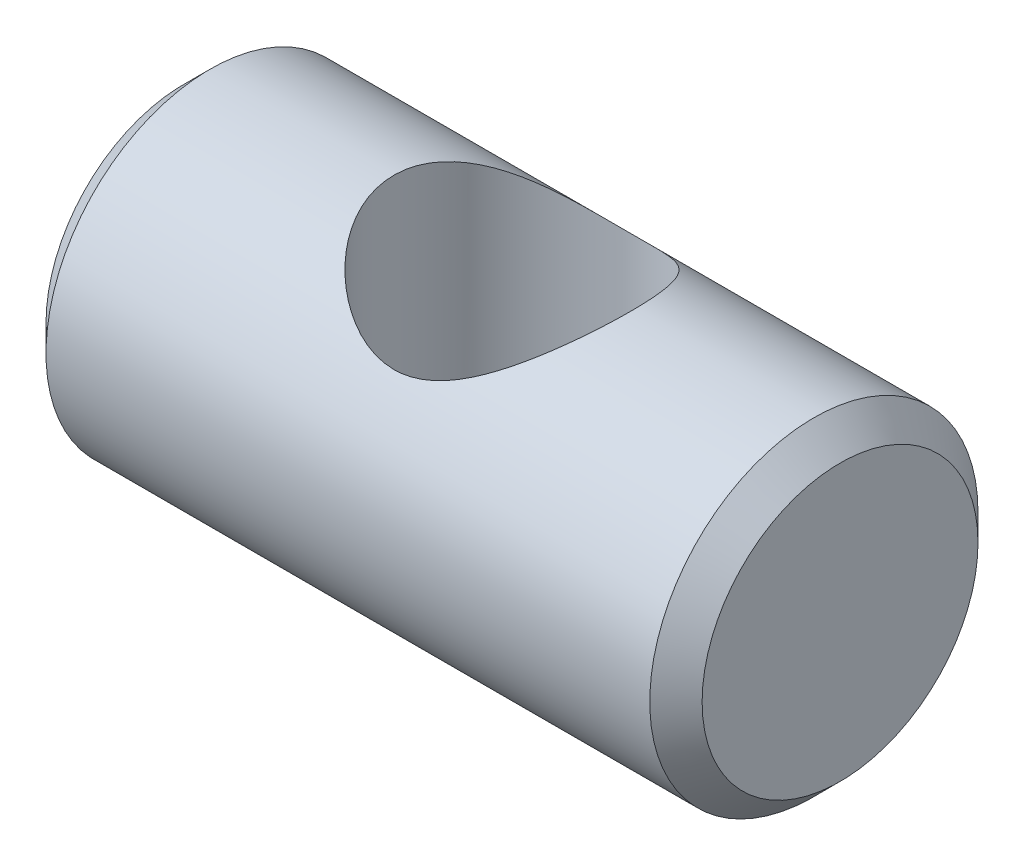
ISO-10303-21;
HEADER;
FILE_DESCRIPTION(('STEP AP214'),'2;1');
FILE_NAME('part.step','',(''),(''),'','','');
FILE_SCHEMA(('AUTOMOTIVE_DESIGN { 1 0 10303 214 1 1 1 1 }'));
ENDSEC;
DATA;
#1=APPLICATION_CONTEXT('core data for automotive mechanical design processes');
#2=APPLICATION_PROTOCOL_DEFINITION('international standard','automotive_design',2000,#1);
#3=PRODUCT_CONTEXT('',#1,'mechanical');
#4=PRODUCT('Part','Part','',(#3));
#5=PRODUCT_RELATED_PRODUCT_CATEGORY('part','',(#4));
#6=PRODUCT_DEFINITION_FORMATION('','',#4);
#7=PRODUCT_DEFINITION_CONTEXT('part definition',#1,'design');
#8=PRODUCT_DEFINITION('design','',#6,#7);
#9=PRODUCT_DEFINITION_SHAPE('','',#8);
#10=(LENGTH_UNIT() NAMED_UNIT(*) SI_UNIT(.MILLI.,.METRE.));
#11=(NAMED_UNIT(*) PLANE_ANGLE_UNIT() SI_UNIT($,.RADIAN.));
#12=(NAMED_UNIT(*) SI_UNIT($,.STERADIAN.) SOLID_ANGLE_UNIT());
#13=UNCERTAINTY_MEASURE_WITH_UNIT(LENGTH_MEASURE(1.E-05),#10,'distance_accuracy_value','');
#14=(GEOMETRIC_REPRESENTATION_CONTEXT(3) GLOBAL_UNCERTAINTY_ASSIGNED_CONTEXT((#13)) GLOBAL_UNIT_ASSIGNED_CONTEXT((#10,
#11,#12)) REPRESENTATION_CONTEXT('',''));
#15=CARTESIAN_POINT('',(0.,0.,0.));
#16=DIRECTION('',(0.,0.,1.));
#17=DIRECTION('',(1.,0.,0.));
#18=AXIS2_PLACEMENT_3D('',#15,#16,#17);
#19=CARTESIAN_POINT('',(19.05,0.,0.));
#20=DIRECTION('',(-1.,0.,0.));
#21=DIRECTION('',(0.,0.,1.));
#22=AXIS2_PLACEMENT_3D('',#19,#20,#21);
#23=CYLINDRICAL_SURFACE('',#22,4.765);
#24=CARTESIAN_POINT('',(6.09500000000002,-4.765,0.));
#25=CARTESIAN_POINT('',(6.09499959610919,-4.76500038568877,0.0847177312181432));
#26=CARTESIAN_POINT('',(6.09814294989109,-4.76273611404079,0.169430320303636));
#27=CARTESIAN_POINT('',(6.11066358139783,-4.75373529485614,0.33818363213569));
#28=CARTESIAN_POINT('',(6.12004307209303,-4.74699715971481,0.422224105655794));
#29=CARTESIAN_POINT('',(6.14488668170268,-4.72920873970222,0.588924625799263));
#30=CARTESIAN_POINT('',(6.16034991528612,-4.71815908226315,0.67158487145527));
#31=CARTESIAN_POINT('',(6.19712124740497,-4.69200787910789,0.834953469422152));
#32=CARTESIAN_POINT('',(6.21843186327193,-4.67690458834067,0.915660964741688));
#33=CARTESIAN_POINT('',(6.29045031365259,-4.62617094260924,1.15316852650018));
#34=CARTESIAN_POINT('',(6.34940304855711,-4.58500087201718,1.30638348551208));
#35=CARTESIAN_POINT('',(6.48662140964981,-4.49105510154723,1.59983536201371));
#36=CARTESIAN_POINT('',(6.56488973292429,-4.43827778103067,1.74007046332845));
#37=CARTESIAN_POINT('',(6.7460643265636,-4.31945657534803,2.01800830989138));
#38=CARTESIAN_POINT('',(6.85055522655824,-4.25264577187922,2.15434410715857));
#39=CARTESIAN_POINT('',(7.07720249701712,-4.11387476134022,2.40879453024458));
#40=CARTESIAN_POINT('',(7.19938539007363,-4.04190690648764,2.52688123888939));
#41=CARTESIAN_POINT('',(7.40679935127932,-3.92720984424589,2.69967192688624));
#42=CARTESIAN_POINT('',(7.48688627416953,-3.88447566291621,2.76064098743456));
#43=CARTESIAN_POINT('',(7.65252198947693,-3.80018618586981,2.87556982119529));
#44=CARTESIAN_POINT('',(7.73807228820807,-3.75863121987704,2.92952764877966));
#45=CARTESIAN_POINT('',(8.00254996269114,-3.6377926860457,3.08028310521369));
#46=CARTESIAN_POINT('',(8.18969989876755,-3.56210417233018,3.16629454903273));
#47=CARTESIAN_POINT('',(8.51939485136452,-3.45483234736675,3.28229960783894));
#48=CARTESIAN_POINT('',(8.65669069310712,-3.4169079996449,3.32141402000292));
#49=CARTESIAN_POINT('',(8.93822532565401,-3.35646405161201,3.38249013814496));
#50=CARTESIAN_POINT('',(9.08244840668605,-3.33391120752371,3.40448887468735));
#51=CARTESIAN_POINT('',(9.37532101808956,-3.30777812718485,3.42989942477073));
#52=CARTESIAN_POINT('',(9.52399395961725,-3.30432779253818,3.43318398182583));
#53=CARTESIAN_POINT('',(9.81967723971873,-3.31741991298231,3.42052722324128));
#54=CARTESIAN_POINT('',(9.96668617107891,-3.33397817475834,3.40457070727668));
#55=CARTESIAN_POINT('',(10.2721444513951,-3.38720452815873,3.35165699745504));
#56=CARTESIAN_POINT('',(10.4297818990276,-3.42609235464718,3.31236160200858));
#57=CARTESIAN_POINT('',(10.7342016018763,-3.51870609796138,3.21379149174679));
#58=CARTESIAN_POINT('',(10.8809584419369,-3.5724654481807,3.15447169211428));
#59=CARTESIAN_POINT('',(11.1144910062973,-3.66874066104023,3.04123108769056));
#60=CARTESIAN_POINT('',(11.2047445197354,-3.70889613431009,2.99228862221962));
#61=CARTESIAN_POINT('',(11.3798000082336,-3.79139086166971,2.8870476482067));
#62=CARTESIAN_POINT('',(11.4646024512642,-3.83372992773559,2.83074977238328));
#63=CARTESIAN_POINT('',(11.6286819133287,-3.91929841302884,2.71104159493219));
#64=CARTESIAN_POINT('',(11.7079534823531,-3.96252865756137,2.64762443422857));
#65=CARTESIAN_POINT('',(11.8606767388077,-4.04867094531033,2.51392387266249));
#66=CARTESIAN_POINT('',(11.9341281711495,-4.09158297450521,2.44364017115065));
#67=CARTESIAN_POINT('',(12.0756650372272,-4.17647896934048,2.29556362017696));
#68=CARTESIAN_POINT('',(12.143681799347,-4.21844733040164,2.21769602860418));
#69=CARTESIAN_POINT('',(12.272955350599,-4.29989137491217,2.05533634915456));
#70=CARTESIAN_POINT('',(12.3342132241495,-4.33936745779475,1.97084532769427));
#71=CARTESIAN_POINT('',(12.4492886648785,-4.41473694574765,1.79565917341629));
#72=CARTESIAN_POINT('',(12.5031195069431,-4.450636710244,1.70497555461375));
#73=CARTESIAN_POINT('',(12.6027495296725,-4.51791109785315,1.51776399509765));
#74=CARTESIAN_POINT('',(12.6485517365294,-4.54928742516665,1.42123827495272));
#75=CARTESIAN_POINT('',(12.7515745829349,-4.62050977119313,1.17456544061184));
#76=CARTESIAN_POINT('',(12.8035135239563,-4.65705260614719,1.02117281951566));
#77=CARTESIAN_POINT('',(12.8855010346838,-4.71513040060247,0.705988354234497));
#78=CARTESIAN_POINT('',(12.9155656190444,-4.73667633912987,0.544202747877958));
#79=CARTESIAN_POINT('',(12.9521791839077,-4.76295229392978,0.216031392103874));
#80=CARTESIAN_POINT('',(12.9586488497531,-4.76762559205244,0.0496320182090406));
#81=CARTESIAN_POINT('',(12.9474171737367,-4.75954299671493,-0.281922100999027));
#82=CARTESIAN_POINT('',(12.9297138780254,-4.7467856943759,-0.447076744618354));
#83=CARTESIAN_POINT('',(12.8727712937309,-4.70611618732336,-0.762721414921801));
#84=CARTESIAN_POINT('',(12.8346822723299,-4.67901421356729,-0.913529209504882));
#85=CARTESIAN_POINT('',(12.7396420868632,-4.61227785723414,-1.20609143238786));
#86=CARTESIAN_POINT('',(12.6826870564159,-4.57264090582636,-1.34784399780876));
#87=CARTESIAN_POINT('',(12.5463466735088,-4.47952673140869,-1.63197484348943));
#88=CARTESIAN_POINT('',(12.4654302950781,-4.42513949950625,-1.77331394441545));
#89=CARTESIAN_POINT('',(12.2864111819194,-4.30826168389104,-2.04094926429533));
#90=CARTESIAN_POINT('',(12.1882959109976,-4.24576519807202,-2.16723439689698));
#91=CARTESIAN_POINT('',(11.9576271688715,-4.10465299201109,-2.42536936475177));
#92=CARTESIAN_POINT('',(11.8220558438335,-4.02517333112418,-2.55405118470738));
#93=CARTESIAN_POINT('',(11.5315920206205,-3.866764636456,-2.78806591398091));
#94=CARTESIAN_POINT('',(11.3766870366769,-3.78783599362576,-2.89338361144201));
#95=CARTESIAN_POINT('',(11.0717646403691,-3.6492564097843,-3.06571333919893));
#96=CARTESIAN_POINT('',(10.924148945703,-3.58845735903786,-3.1360351201623));
#97=CARTESIAN_POINT('',(10.6162506817858,-3.48002124223204,-3.25595284611108));
#98=CARTESIAN_POINT('',(10.4559956729631,-3.43235650407537,-3.30559248021485));
#99=CARTESIAN_POINT('',(10.158089931823,-3.36518869683095,-3.37380690797711));
#100=CARTESIAN_POINT('',(10.0222632529116,-3.34197440203271,-3.39659121549822));
#101=CARTESIAN_POINT('',(9.74710649968959,-3.31225678048614,-3.42558639072587));
#102=CARTESIAN_POINT('',(9.6077810239035,-3.30573257074766,-3.43181796993377));
#103=CARTESIAN_POINT('',(9.32963848724307,-3.31045774857882,-3.42725818139827));
#104=CARTESIAN_POINT('',(9.19082181868192,-3.32171876848702,-3.41645567260397));
#105=CARTESIAN_POINT('',(8.91761315614652,-3.36018548165847,-3.37862015400287));
#106=CARTESIAN_POINT('',(8.78322844018555,-3.38741614463826,-3.35156172524388));
#107=CARTESIAN_POINT('',(8.47901089021318,-3.46500445620298,-3.27153835075048));
#108=CARTESIAN_POINT('',(8.31185103658576,-3.52000205613634,-3.21301195645724));
#109=CARTESIAN_POINT('',(7.99221338480471,-3.6425018189336,-3.07343681610102));
#110=CARTESIAN_POINT('',(7.83976074812907,-3.71002485349893,-2.99235036276751));
#111=CARTESIAN_POINT('',(7.54624351433185,-3.85212789013876,-2.80719769512117));
#112=CARTESIAN_POINT('',(7.40561832733594,-3.92685271703972,-2.7025506739677));
#113=CARTESIAN_POINT('',(7.14152022812123,-4.07546327279583,-2.47275982811188));
#114=CARTESIAN_POINT('',(7.01805331588238,-4.14934869987431,-2.34760886666907));
#115=CARTESIAN_POINT('',(6.83635821689446,-4.26219687307588,-2.13240779190859));
#116=CARTESIAN_POINT('',(6.77192267768827,-4.30321102404401,-2.04859844379145));
#117=CARTESIAN_POINT('',(6.6504516655069,-4.38191825181171,-1.87433788931678));
#118=CARTESIAN_POINT('',(6.59341288108394,-4.41961281231398,-1.78388968370403));
#119=CARTESIAN_POINT('',(6.48745606054911,-4.49059625248441,-1.59680172900397));
#120=CARTESIAN_POINT('',(6.43853230591874,-4.52388823119142,-1.5001664069973));
#121=CARTESIAN_POINT('',(6.34955220596911,-4.5850571293326,-1.301264375057));
#122=CARTESIAN_POINT('',(6.30949296081786,-4.61293581924006,-1.19899952041401));
#123=CARTESIAN_POINT('',(6.2450964516419,-4.65807487009905,-1.00771753586218));
#124=CARTESIAN_POINT('',(6.21924023703891,-4.67633675824679,-0.919445875934476));
#125=CARTESIAN_POINT('',(6.17457046904347,-4.70802022116129,-0.740296298593746));
#126=CARTESIAN_POINT('',(6.15575528330252,-4.72144291778977,-0.649418990524394));
#127=CARTESIAN_POINT('',(6.12552125844282,-4.74306537715817,-0.465920761812788));
#128=CARTESIAN_POINT('',(6.11409499638959,-4.75127038146896,-0.373301687543516));
#129=CARTESIAN_POINT('',(6.09883487265058,-4.76223727742007,-0.187119604642967));
#130=CARTESIAN_POINT('',(6.09500044603037,-4.76499957407079,-0.093556666768616));
#131=CARTESIAN_POINT('',(6.09500000000002,-4.765,0.));
#132=B_SPLINE_CURVE_WITH_KNOTS('',3,(#24,#25,#26,#27,#28,#29,#30,#31,#32,#33,#34,#35,#36,#37,
#38,#39,#40,#41,#42,#43,#44,#45,#46,#47,#48,#49,#50,#51,#52,#53,#54,#55,#56,#57,#58,#59,#60,#61,
#62,#63,#64,#65,#66,#67,#68,#69,#70,#71,#72,#73,#74,#75,#76,#77,#78,#79,#80,#81,#82,#83,#84,#85,
#86,#87,#88,#89,#90,#91,#92,#93,#94,#95,#96,#97,#98,#99,#100,#101,#102,#103,#104,#105,#106,#107,
#108,#109,#110,#111,#112,#113,#114,#115,#116,#117,#118,#119,#120,#121,#122,#123,#124,#125,#126,
#127,#128,#129,#130,#131),.UNSPECIFIED.,.T.,.F.,(4,2,2,2,2,2,2,2,2,2,2,2,2,2,2,2,2,2,2,2,2,2,2,
2,2,2,2,2,2,2,2,2,2,2,2,2,2,2,2,2,2,2,2,2,2,2,2,2,2,2,2,2,2,4),(0.,0.254056144534474,
0.508202492188904,0.762311869105355,1.01653081366771,1.52186449966476,2.0272687866938,
2.57821641184627,3.12999869834548,3.45770025357787,3.7854925531708,4.43939851343425,
4.88097136957113,5.32158618479439,5.76519363893576,6.20915176984628,6.70762640117556,
7.20723091465315,7.53759139604015,7.86792347822831,8.1985765954357,8.52924419668192,
8.86358500026263,9.19787208286409,9.53155370673103,9.86510928598013,10.360901375871,
10.856330120196,11.3534227282806,11.8505555176942,12.3222092140893,12.7939596306007,
13.3071563441909,13.8207286918533,14.4277422512297,15.0351498711535,15.5567378752995,
16.0772184174324,16.4944268013625,16.9111129093764,17.3280716616901,17.7456841045647,
18.2990144207386,18.853275196935,19.4230836966979,19.9930909508798,20.332859584608,
20.6724755785373,21.011851224868,21.3511156871554,21.6320471618883,21.9129134668015,
22.1934971724466,22.4740599981145),.UNSPECIFIED.);
#133=CARTESIAN_POINT('',(6.09500000000002,-4.765,0.));
#134=VERTEX_POINT('',#133);
#135=EDGE_CURVE('E10',#134,#134,#132,.T.);
#136=ORIENTED_EDGE('',*,*,#135,.T.);
#137=EDGE_LOOP('',(#136));
#138=FACE_BOUND('',#137,.T.);
#139=CARTESIAN_POINT('',(9.52500000000002,3.30761621111035,3.43));
#140=CARTESIAN_POINT('',(9.44359796146425,3.30761776842519,3.42999918864106));
#141=CARTESIAN_POINT('',(9.36218407056381,3.31063705514595,3.42709478577341));
#142=CARTESIAN_POINT('',(9.20016144139,3.32254520620497,3.41555039780778));
#143=CARTESIAN_POINT('',(9.11955323769195,3.33143773495609,3.40690683193314));
#144=CARTESIAN_POINT('',(8.95972677630651,3.35463714094608,3.38406531826882));
#145=CARTESIAN_POINT('',(8.88051232495892,3.36895698003822,3.36985407062161));
#146=CARTESIAN_POINT('',(8.72420699342421,3.40231588725374,3.33617036729262));
#147=CARTESIAN_POINT('',(8.64711738884878,3.42135772440774,3.31669482396565));
#148=CARTESIAN_POINT('',(8.42165336111231,3.48382518219671,3.25142621581383));
#149=CARTESIAN_POINT('',(8.27688018213992,3.53295223931879,3.19846108859091));
#150=CARTESIAN_POINT('',(7.99877939151398,3.64048939042037,3.07550378113376));
#151=CARTESIAN_POINT('',(7.86545060597325,3.69889853055096,3.00551335006843));
#152=CARTESIAN_POINT('',(7.58648070444628,3.83150331223241,2.83523058687006));
#153=CARTESIAN_POINT('',(7.44323542715552,3.90660269980671,2.73171543067713));
#154=CARTESIAN_POINT('',(7.17392980917619,4.05652006047322,2.5037001159196));
#155=CARTESIAN_POINT('',(7.04789275646875,4.13133752154036,2.37917201984086));
#156=CARTESIAN_POINT('',(6.86277920323917,4.24556805593846,2.16529760967855));
#157=CARTESIAN_POINT('',(6.79739511320831,4.28694907374565,2.08238514374896));
#158=CARTESIAN_POINT('',(6.67394608793832,4.36653195988115,1.9098781253717));
#159=CARTESIAN_POINT('',(6.61587782675788,4.40473527016354,1.82028663905997));
#160=CARTESIAN_POINT('',(6.50780139229153,4.47685118668652,1.63490106114947));
#161=CARTESIAN_POINT('',(6.45778201110923,4.51076974494608,1.53911585951493));
#162=CARTESIAN_POINT('',(6.36650662275987,4.57332525741562,1.34187667409253));
#163=CARTESIAN_POINT('',(6.32524649238828,4.60196469580302,1.24042538601124));
#164=CARTESIAN_POINT('',(6.23637581543262,4.66411353106844,0.987312568578566));
#165=CARTESIAN_POINT('',(6.19380454317669,4.69432595851433,0.832999309907671));
#166=CARTESIAN_POINT('',(6.13051974711707,4.73944390060314,0.517884205864162));
#167=CARTESIAN_POINT('',(6.10978809483452,4.75436211028707,0.357087857239514));
#168=CARTESIAN_POINT('',(6.09131818644795,4.76764635210463,0.0331106632530537));
#169=CARTESIAN_POINT('',(6.09363034381811,4.76597609329068,-0.130074629940496));
#170=CARTESIAN_POINT('',(6.12123458778608,4.74614098997373,-0.453473660086339));
#171=CARTESIAN_POINT('',(6.14653275434741,4.72797178138148,-0.613686599388157));
#172=CARTESIAN_POINT('',(6.21764552540146,4.67742620490943,-0.922349059984801));
#173=CARTESIAN_POINT('',(6.26288265392544,4.64545020844664,-1.07100011329414));
#174=CARTESIAN_POINT('',(6.37162441351807,4.56974645623048,-1.35820766764044));
#175=CARTESIAN_POINT('',(6.43513269106296,4.52601635475872,-1.49676214672241));
#176=CARTESIAN_POINT('',(6.58618148777766,4.42419680091417,-1.77658934822833));
#177=CARTESIAN_POINT('',(6.67560842239394,4.36505164034656,-1.91645292811232));
#178=CARTESIAN_POINT('',(6.87175812429219,4.23961424044081,-2.1799632079838));
#179=CARTESIAN_POINT('',(6.97849823576941,4.17331485658966,-2.30359341841757));
#180=CARTESIAN_POINT('',(7.22875272169333,4.02505079077683,-2.55524493897775));
#181=CARTESIAN_POINT('',(7.37541263307137,3.9424711733114,-2.67978228741706));
#182=CARTESIAN_POINT('',(7.68878036903881,3.78073783732062,-2.90349117675101));
#183=CARTESIAN_POINT('',(7.85548885435193,3.70158423182039,-3.00266188132186));
#184=CARTESIAN_POINT('',(8.16882893018811,3.57266844152221,-3.15418366724013));
#185=CARTESIAN_POINT('',(8.31170273924315,3.52028223872797,-3.21204111340728));
#186=CARTESIAN_POINT('',(8.60787948423819,3.42953641535839,-3.3087656279113));
#187=CARTESIAN_POINT('',(8.76115832282199,3.39114561413462,-3.34767497692611));
#188=CARTESIAN_POINT('',(9.05124602577449,3.33881503385712,-3.39981036860877));
#189=CARTESIAN_POINT('',(9.18698300968215,3.32203140316326,-3.41605679352166));
#190=CARTESIAN_POINT('',(9.46043061576793,3.30543988741879,-3.43211991719663));
#191=CARTESIAN_POINT('',(9.59813974562484,3.30561978122036,-3.4319484440158));
#192=CARTESIAN_POINT('',(9.87118187803283,3.32288915506671,-3.41522391835476));
#193=CARTESIAN_POINT('',(10.0065185824781,3.33994935122144,-3.39869923535787));
#194=CARTESIAN_POINT('',(10.27186074815,3.38836511388486,-3.35042547694232));
#195=CARTESIAN_POINT('',(10.4018578883026,3.4197421339738,-3.31865355000988));
#196=CARTESIAN_POINT('',(10.7064553675357,3.50813233030795,-3.22549691393665));
#197=CARTESIAN_POINT('',(10.8774349580402,3.57038174524695,-3.15730866715353));
#198=CARTESIAN_POINT('',(11.20303526365,3.70595313818717,-2.9970272592147));
#199=CARTESIAN_POINT('',(11.357622746024,3.77929690501084,-2.90488679526846));
#200=CARTESIAN_POINT('',(11.6536763340265,3.93129198316696,-2.69580359039099));
#201=CARTESIAN_POINT('',(11.7946581424325,4.01003416415893,-2.5782425092746));
#202=CARTESIAN_POINT('',(12.0569445891547,4.16411342053437,-2.32116677073248));
#203=CARTESIAN_POINT('',(12.178267053333,4.23945353546831,-2.18167222994526));
#204=CARTESIAN_POINT('',(12.3916016940623,4.37624244780666,-1.89150742529311));
#205=CARTESIAN_POINT('',(12.4849983293556,4.43827339699239,-1.742135506112));
#206=CARTESIAN_POINT('',(12.6492032541642,4.54942980885924,-1.42679036463322));
#207=CARTESIAN_POINT('',(12.7200193923573,4.5985597547059,-1.26082293711808));
#208=CARTESIAN_POINT('',(12.806774492904,4.6593942518596,-1.00164613231786));
#209=CARTESIAN_POINT('',(12.8325205426448,4.67758234033205,-0.913120057388833));
#210=CARTESIAN_POINT('',(12.8769322872855,4.70908970031716,-0.73347886885611));
#211=CARTESIAN_POINT('',(12.8956016283031,4.72241147895955,-0.642365114580646));
#212=CARTESIAN_POINT('',(12.9255123075814,4.74380655916189,-0.458369221699818));
#213=CARTESIAN_POINT('',(12.9367575626452,4.75188262821961,-0.365488042208054));
#214=CARTESIAN_POINT('',(12.9516150584392,4.76256113402722,-0.178809575019191));
#215=CARTESIAN_POINT('',(12.9552283965806,4.76516435773006,-0.0850124209810961));
#216=CARTESIAN_POINT('',(12.9547818053649,4.76484297924135,0.0897828195454044));
#217=CARTESIAN_POINT('',(12.9516988117277,4.7626221588484,0.170786319987316));
#218=CARTESIAN_POINT('',(12.9398388522843,4.75409668800219,0.332167355747924));
#219=CARTESIAN_POINT('',(12.9310600364174,4.74779071064953,0.412544679090379));
#220=CARTESIAN_POINT('',(12.8963446664959,4.72292339365472,0.651781033805039));
#221=CARTESIAN_POINT('',(12.8620284020266,4.6984119598312,0.808913944039926));
#222=CARTESIAN_POINT('',(12.7734535548455,4.6359263768828,1.11229121692376));
#223=CARTESIAN_POINT('',(12.719441439392,4.59811881071508,1.25864437324627));
#224=CARTESIAN_POINT('',(12.5937026333034,4.51167117995918,1.54003858984487));
#225=CARTESIAN_POINT('',(12.521973031034,4.46302933503015,1.6750777859319));
#226=CARTESIAN_POINT('',(12.3521445234142,4.35068587431454,1.94979264340275));
#227=CARTESIAN_POINT('',(12.2517838026686,4.28583519897226,2.0875903592959));
#228=CARTESIAN_POINT('',(12.0334263188984,4.15032061508074,2.34548702714922));
#229=CARTESIAN_POINT('',(11.9154039042247,4.07964831952234,2.4655597231043));
#230=CARTESIAN_POINT('',(11.7148360489843,3.96634971162313,2.64185348081618));
#231=CARTESIAN_POINT('',(11.6374009641132,3.92401508470718,2.70417268912592));
#232=CARTESIAN_POINT('',(11.4771427149644,3.84012139816795,2.82204524756536));
#233=CARTESIAN_POINT('',(11.3943181471876,3.79856254422233,2.87759682440142));
#234=CARTESIAN_POINT('',(11.1380830175248,3.67690814111049,3.03361744392612));
#235=CARTESIAN_POINT('',(10.9566328866015,3.59966945231082,3.12369786533345));
#236=CARTESIAN_POINT('',(10.6313974249465,3.48551924779467,3.24982741718261));
#237=CARTESIAN_POINT('',(10.4925859499066,3.44345626817472,3.29397865224323));
#238=CARTESIAN_POINT('',(10.2785973115811,3.39167249586216,3.34699608430657));
#239=CARTESIAN_POINT('',(10.2063926297669,3.37630760622148,3.36245672146341));
#240=CARTESIAN_POINT('',(10.0603864100883,3.34989869642638,3.38876900247123));
#241=CARTESIAN_POINT('',(9.98658568874914,3.33885251955991,3.39962294708016));
#242=CARTESIAN_POINT('',(9.84825972326986,3.32276717723329,3.41534045687266));
#243=CARTESIAN_POINT('',(9.78387728785286,3.31710485104418,3.42082860533395));
#244=CARTESIAN_POINT('',(9.65466582300344,3.30952821170844,3.42815922145793));
#245=CARTESIAN_POINT('',(9.58983667113831,3.30761497071009,3.43000064624687));
#246=CARTESIAN_POINT('',(9.52500000000002,3.30761621111035,3.43));
#247=B_SPLINE_CURVE_WITH_KNOTS('',3,(#139,#140,#141,#142,#143,#144,#145,#146,#147,#148,#149,
#150,#151,#152,#153,#154,#155,#156,#157,#158,#159,#160,#161,#162,#163,#164,#165,#166,#167,#168,
#169,#170,#171,#172,#173,#174,#175,#176,#177,#178,#179,#180,#181,#182,#183,#184,#185,#186,#187,
#188,#189,#190,#191,#192,#193,#194,#195,#196,#197,#198,#199,#200,#201,#202,#203,#204,#205,#206,
#207,#208,#209,#210,#211,#212,#213,#214,#215,#216,#217,#218,#219,#220,#221,#222,#223,#224,#225,
#226,#227,#228,#229,#230,#231,#232,#233,#234,#235,#236,#237,#238,#239,#240,#241,#242,#243,#244,
#245,#246),.UNSPECIFIED.,.T.,.F.,(4,2,2,2,2,2,2,2,2,2,2,2,2,2,2,2,2,2,2,2,2,2,2,2,2,2,2,2,2,2,2,
2,2,2,2,2,2,2,2,2,2,2,2,2,2,2,2,2,2,2,2,2,2,4),(0.,0.244121231467741,0.488394918274502,
0.733255709481724,0.978260430666176,1.46158753667942,1.94486500693025,2.51897543457968,
3.09385526676081,3.43367812430526,3.77334592889189,4.11253658189007,4.45156721334802,
4.93801025474995,5.42404919398381,5.91115168482385,6.39838305526931,6.87234588132182,
7.34640336450454,7.87314437808767,8.40041637306114,9.02605952943899,9.65172331025712,
10.1385037543623,10.6241929647026,11.0355129972519,11.4465367019663,11.8568486121367,
12.267777399063,12.8475544509856,13.4284853093657,14.0255674248294,14.6221050769229,
15.1802237793126,15.7381482751203,16.0197030121132,16.3011124864339,16.5823733757045,
16.8635938190611,17.1065597222475,17.3496045827585,17.8351925843091,18.3149016758906,
18.7946896538131,19.3398903171276,19.8858906502389,20.2096761541077,20.5335463164645,
21.180081609351,21.6331768971706,21.8592026936634,22.085115471036,22.2795022924366,
22.4739446956891),.UNSPECIFIED.);
#248=CARTESIAN_POINT('',(9.52500000000002,3.30761621111035,3.43));
#249=VERTEX_POINT('',#248);
#250=EDGE_CURVE('E53',#249,#249,#247,.T.);
#251=ORIENTED_EDGE('',*,*,#250,.T.);
#252=EDGE_LOOP('',(#251));
#253=FACE_BOUND('',#252,.T.);
#254=CARTESIAN_POINT('',(0.760000000000007,0.,0.));
#255=DIRECTION('',(1.,0.,0.));
#256=DIRECTION('',(0.,0.,-1.));
#257=AXIS2_PLACEMENT_3D('',#254,#255,#256);
#258=CIRCLE('',#257,4.765);
#259=CARTESIAN_POINT('',(0.760000000000007,0.,-4.765));
#260=VERTEX_POINT('',#259);
#261=EDGE_CURVE('E96',#260,#260,#258,.T.);
#262=ORIENTED_EDGE('',*,*,#261,.T.);
#263=EDGE_LOOP('',(#262));
#264=FACE_BOUND('',#263,.T.);
#265=CARTESIAN_POINT('',(18.29,0.,0.));
#266=DIRECTION('',(1.,0.,0.));
#267=DIRECTION('',(0.,0.,-1.));
#268=AXIS2_PLACEMENT_3D('',#265,#266,#267);
#269=CIRCLE('',#268,4.765);
#270=CARTESIAN_POINT('',(18.29,0.,-4.765));
#271=VERTEX_POINT('',#270);
#272=EDGE_CURVE('E99',#271,#271,#269,.F.);
#273=ORIENTED_EDGE('',*,*,#272,.T.);
#274=EDGE_LOOP('',(#273));
#275=FACE_BOUND('',#274,.T.);
#276=ADVANCED_FACE('F39',(#138,#253,#264,#275),#23,.T.);
#277=CARTESIAN_POINT('',(19.05,0.,0.));
#278=DIRECTION('',(1.,0.,0.));
#279=DIRECTION('',(0.,0.,-1.));
#280=AXIS2_PLACEMENT_3D('',#277,#278,#279);
#281=PLANE('',#280);
#282=CARTESIAN_POINT('',(19.05,0.,0.));
#283=DIRECTION('',(1.,0.,0.));
#284=DIRECTION('',(0.,0.,-1.));
#285=AXIS2_PLACEMENT_3D('',#282,#283,#284);
#286=CIRCLE('',#285,4.00500000000001);
#287=CARTESIAN_POINT('',(19.05,0.,-4.00500000000001));
#288=VERTEX_POINT('',#287);
#289=EDGE_CURVE('E58',#288,#288,#286,.T.);
#290=ORIENTED_EDGE('',*,*,#289,.T.);
#291=EDGE_LOOP('',(#290));
#292=FACE_BOUND('',#291,.T.);
#293=ADVANCED_FACE('F76',(#292),#281,.T.);
#294=CARTESIAN_POINT('',(0.,0.,0.));
#295=DIRECTION('',(1.,0.,0.));
#296=DIRECTION('',(0.,0.,-1.));
#297=AXIS2_PLACEMENT_3D('',#294,#295,#296);
#298=PLANE('',#297);
#299=CARTESIAN_POINT('',(0.,0.,0.));
#300=DIRECTION('',(1.,0.,0.));
#301=DIRECTION('',(0.,0.,-1.));
#302=AXIS2_PLACEMENT_3D('',#299,#300,#301);
#303=CIRCLE('',#302,4.00499999999999);
#304=CARTESIAN_POINT('',(0.,0.,-4.00499999999999));
#305=VERTEX_POINT('',#304);
#306=EDGE_CURVE('E63',#305,#305,#303,.F.);
#307=ORIENTED_EDGE('',*,*,#306,.T.);
#308=EDGE_LOOP('',(#307));
#309=FACE_BOUND('',#308,.T.);
#310=ADVANCED_FACE('F79',(#309),#298,.F.);
#311=CARTESIAN_POINT('',(0.760000000000007,0.,0.));
#312=DIRECTION('',(1.,0.,0.));
#313=DIRECTION('',(0.,0.,-1.));
#314=AXIS2_PLACEMENT_3D('',#311,#312,#313);
#315=CONICAL_SURFACE('',#314,4.765,0.785398163397449);
#316=ORIENTED_EDGE('',*,*,#306,.F.);
#317=EDGE_LOOP('',(#316));
#318=FACE_BOUND('',#317,.T.);
#319=ORIENTED_EDGE('',*,*,#261,.F.);
#320=EDGE_LOOP('',(#319));
#321=FACE_BOUND('',#320,.T.);
#322=ADVANCED_FACE('F82',(#318,#321),#315,.T.);
#323=CARTESIAN_POINT('',(19.05,0.,0.));
#324=DIRECTION('',(-1.,0.,0.));
#325=DIRECTION('',(0.,0.,1.));
#326=AXIS2_PLACEMENT_3D('',#323,#324,#325);
#327=CONICAL_SURFACE('',#326,4.00500000000001,0.785398163397449);
#328=ORIENTED_EDGE('',*,*,#272,.F.);
#329=EDGE_LOOP('',(#328));
#330=FACE_BOUND('',#329,.T.);
#331=ORIENTED_EDGE('',*,*,#289,.F.);
#332=EDGE_LOOP('',(#331));
#333=FACE_BOUND('',#332,.T.);
#334=ADVANCED_FACE('F42',(#330,#333),#327,.T.);
#335=CARTESIAN_POINT('',(9.52500000000002,-4.765,0.));
#336=DIRECTION('',(0.,1.,0.));
#337=DIRECTION('',(0.,0.,1.));
#338=AXIS2_PLACEMENT_3D('',#335,#336,#337);
#339=CYLINDRICAL_SURFACE('',#338,3.43);
#340=ORIENTED_EDGE('',*,*,#250,.F.);
#341=EDGE_LOOP('',(#340));
#342=FACE_BOUND('',#341,.T.);
#343=ORIENTED_EDGE('',*,*,#135,.F.);
#344=EDGE_LOOP('',(#343));
#345=FACE_BOUND('',#344,.T.);
#346=ADVANCED_FACE('F71',(#342,#345),#339,.F.);
#347=CLOSED_SHELL('',(#276,#293,#310,#322,#334,#346));
#348=MANIFOLD_SOLID_BREP('B2',#347);
#349=ADVANCED_BREP_SHAPE_REPRESENTATION('',(#18,#348),#14);
#350=SHAPE_DEFINITION_REPRESENTATION(#9,#349);
ENDSEC;
END-ISO-10303-21;
